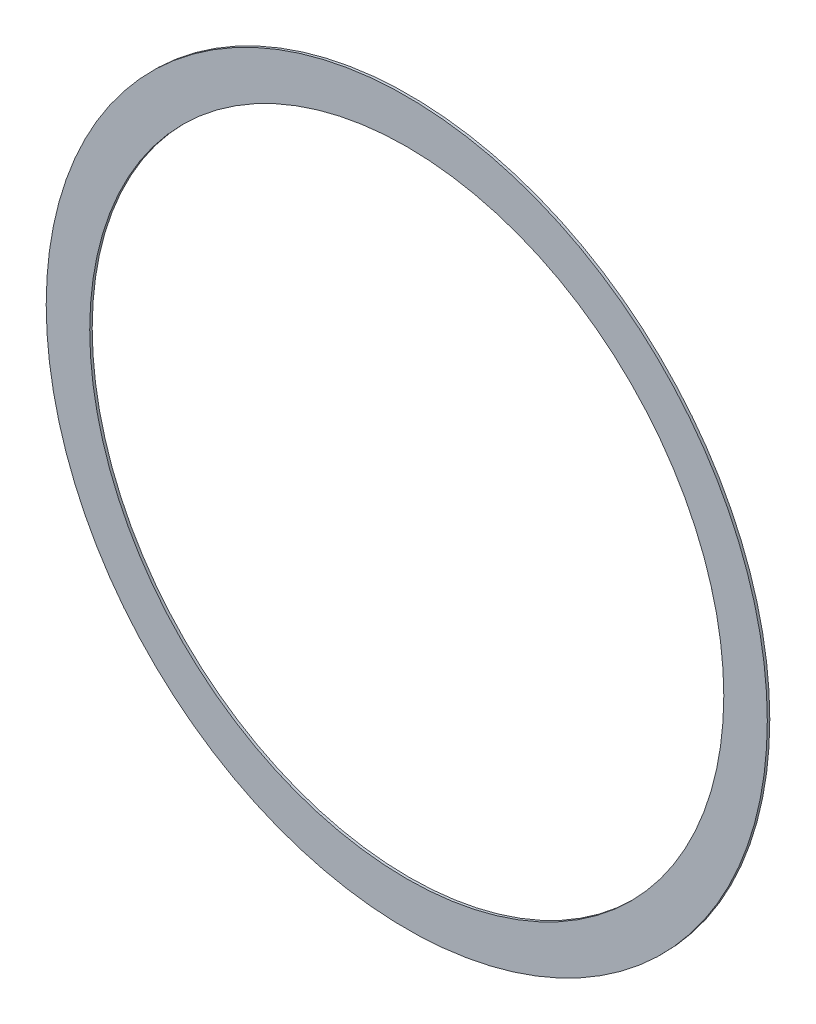
ISO-10303-21;
HEADER;
FILE_DESCRIPTION(('STEP AP214'),'2;1');
FILE_NAME('part.step','',(''),(''),'','','');
FILE_SCHEMA(('AUTOMOTIVE_DESIGN { 1 0 10303 214 1 1 1 1 }'));
ENDSEC;
DATA;
#1=APPLICATION_CONTEXT('core data for automotive mechanical design processes');
#2=APPLICATION_PROTOCOL_DEFINITION('international standard','automotive_design',2000,#1);
#3=PRODUCT_CONTEXT('',#1,'mechanical');
#4=PRODUCT('Part','Part','',(#3));
#5=PRODUCT_RELATED_PRODUCT_CATEGORY('part','',(#4));
#6=PRODUCT_DEFINITION_FORMATION('','',#4);
#7=PRODUCT_DEFINITION_CONTEXT('part definition',#1,'design');
#8=PRODUCT_DEFINITION('design','',#6,#7);
#9=PRODUCT_DEFINITION_SHAPE('','',#8);
#10=(LENGTH_UNIT() NAMED_UNIT(*) SI_UNIT(.MILLI.,.METRE.));
#11=(NAMED_UNIT(*) PLANE_ANGLE_UNIT() SI_UNIT($,.RADIAN.));
#12=(NAMED_UNIT(*) SI_UNIT($,.STERADIAN.) SOLID_ANGLE_UNIT());
#13=UNCERTAINTY_MEASURE_WITH_UNIT(LENGTH_MEASURE(1.E-05),#10,'distance_accuracy_value','');
#14=(GEOMETRIC_REPRESENTATION_CONTEXT(3) GLOBAL_UNCERTAINTY_ASSIGNED_CONTEXT((#13)) GLOBAL_UNIT_ASSIGNED_CONTEXT((#10,
#11,#12)) REPRESENTATION_CONTEXT('',''));
#15=CARTESIAN_POINT('',(0.,0.,0.));
#16=DIRECTION('',(0.,0.,1.));
#17=DIRECTION('',(1.,0.,0.));
#18=AXIS2_PLACEMENT_3D('',#15,#16,#17);
#19=CARTESIAN_POINT('',(0.,0.,0.1));
#20=DIRECTION('',(0.,0.,1.));
#21=DIRECTION('',(1.,0.,0.));
#22=AXIS2_PLACEMENT_3D('',#19,#20,#21);
#23=PLANE('',#22);
#24=CARTESIAN_POINT('',(0.,0.,0.1));
#25=DIRECTION('',(0.,0.,1.));
#26=DIRECTION('',(1.,0.,0.));
#27=AXIS2_PLACEMENT_3D('',#24,#25,#26);
#28=CIRCLE('',#27,14.5);
#29=CARTESIAN_POINT('',(14.5,0.,0.1));
#30=VERTEX_POINT('',#29);
#31=EDGE_CURVE('E11',#30,#30,#28,.T.);
#32=ORIENTED_EDGE('',*,*,#31,.T.);
#33=EDGE_LOOP('',(#32));
#34=FACE_BOUND('',#33,.T.);
#35=CARTESIAN_POINT('',(0.,0.,0.1));
#36=DIRECTION('',(0.,0.,1.));
#37=DIRECTION('',(1.,0.,0.));
#38=AXIS2_PLACEMENT_3D('',#35,#36,#37);
#39=CIRCLE('',#38,12.75);
#40=CARTESIAN_POINT('',(12.75,0.,0.1));
#41=VERTEX_POINT('',#40);
#42=EDGE_CURVE('E47',#41,#41,#39,.T.);
#43=ORIENTED_EDGE('',*,*,#42,.F.);
#44=EDGE_LOOP('',(#43));
#45=FACE_BOUND('',#44,.T.);
#46=ADVANCED_FACE('F34',(#34,#45),#23,.T.);
#47=CARTESIAN_POINT('',(0.,0.,0.));
#48=DIRECTION('',(0.,0.,1.));
#49=DIRECTION('',(1.,0.,0.));
#50=AXIS2_PLACEMENT_3D('',#47,#48,#49);
#51=PLANE('',#50);
#52=CARTESIAN_POINT('',(0.,0.,0.));
#53=DIRECTION('',(0.,0.,1.));
#54=DIRECTION('',(1.,0.,0.));
#55=AXIS2_PLACEMENT_3D('',#52,#53,#54);
#56=CIRCLE('',#55,14.5);
#57=CARTESIAN_POINT('',(14.5,0.,0.));
#58=VERTEX_POINT('',#57);
#59=EDGE_CURVE('E38',#58,#58,#56,.T.);
#60=ORIENTED_EDGE('',*,*,#59,.F.);
#61=EDGE_LOOP('',(#60));
#62=FACE_BOUND('',#61,.T.);
#63=CARTESIAN_POINT('',(0.,0.,0.));
#64=DIRECTION('',(0.,0.,1.));
#65=DIRECTION('',(1.,0.,0.));
#66=AXIS2_PLACEMENT_3D('',#63,#64,#65);
#67=CIRCLE('',#66,12.75);
#68=CARTESIAN_POINT('',(12.75,0.,0.));
#69=VERTEX_POINT('',#68);
#70=EDGE_CURVE('E50',#69,#69,#67,.T.);
#71=ORIENTED_EDGE('',*,*,#70,.T.);
#72=EDGE_LOOP('',(#71));
#73=FACE_BOUND('',#72,.T.);
#74=ADVANCED_FACE('F60',(#62,#73),#51,.F.);
#75=CARTESIAN_POINT('',(0.,0.,0.1));
#76=DIRECTION('',(0.,0.,-1.));
#77=DIRECTION('',(-1.,0.,0.));
#78=AXIS2_PLACEMENT_3D('',#75,#76,#77);
#79=CYLINDRICAL_SURFACE('',#78,14.5);
#80=ORIENTED_EDGE('',*,*,#31,.F.);
#81=EDGE_LOOP('',(#80));
#82=FACE_BOUND('',#81,.T.);
#83=ORIENTED_EDGE('',*,*,#59,.T.);
#84=EDGE_LOOP('',(#83));
#85=FACE_BOUND('',#84,.T.);
#86=ADVANCED_FACE('F36',(#82,#85),#79,.T.);
#87=CARTESIAN_POINT('',(0.,0.,0.1));
#88=DIRECTION('',(0.,0.,-1.));
#89=DIRECTION('',(-1.,0.,0.));
#90=AXIS2_PLACEMENT_3D('',#87,#88,#89);
#91=CYLINDRICAL_SURFACE('',#90,12.75);
#92=ORIENTED_EDGE('',*,*,#42,.T.);
#93=EDGE_LOOP('',(#92));
#94=FACE_BOUND('',#93,.T.);
#95=ORIENTED_EDGE('',*,*,#70,.F.);
#96=EDGE_LOOP('',(#95));
#97=FACE_BOUND('',#96,.T.);
#98=ADVANCED_FACE('F56',(#94,#97),#91,.F.);
#99=CLOSED_SHELL('',(#46,#74,#86,#98));
#100=MANIFOLD_SOLID_BREP('B2',#99);
#101=ADVANCED_BREP_SHAPE_REPRESENTATION('',(#18,#100),#14);
#102=SHAPE_DEFINITION_REPRESENTATION(#9,#101);
ENDSEC;
END-ISO-10303-21;
